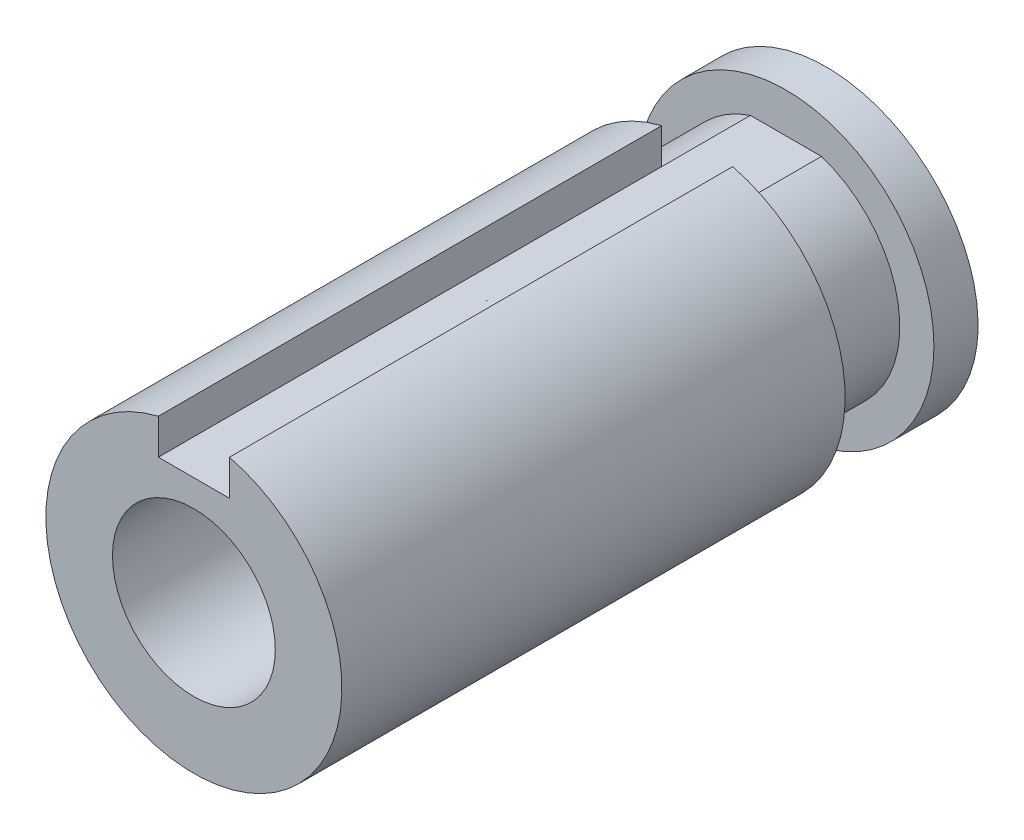
ISO-10303-21;
HEADER;
FILE_DESCRIPTION(('STEP AP214'),'2;1');
FILE_NAME('part.step','',(''),(''),'','','');
FILE_SCHEMA(('AUTOMOTIVE_DESIGN { 1 0 10303 214 1 1 1 1 }'));
ENDSEC;
DATA;
#1=APPLICATION_CONTEXT('core data for automotive mechanical design processes');
#2=APPLICATION_PROTOCOL_DEFINITION('international standard','automotive_design',2000,#1);
#3=PRODUCT_CONTEXT('',#1,'mechanical');
#4=PRODUCT('Part','Part','',(#3));
#5=PRODUCT_RELATED_PRODUCT_CATEGORY('part','',(#4));
#6=PRODUCT_DEFINITION_FORMATION('','',#4);
#7=PRODUCT_DEFINITION_CONTEXT('part definition',#1,'design');
#8=PRODUCT_DEFINITION('design','',#6,#7);
#9=PRODUCT_DEFINITION_SHAPE('','',#8);
#10=(LENGTH_UNIT() NAMED_UNIT(*) SI_UNIT(.MILLI.,.METRE.));
#11=(NAMED_UNIT(*) PLANE_ANGLE_UNIT() SI_UNIT($,.RADIAN.));
#12=(NAMED_UNIT(*) SI_UNIT($,.STERADIAN.) SOLID_ANGLE_UNIT());
#13=UNCERTAINTY_MEASURE_WITH_UNIT(LENGTH_MEASURE(1.E-05),#10,'distance_accuracy_value','');
#14=(GEOMETRIC_REPRESENTATION_CONTEXT(3) GLOBAL_UNCERTAINTY_ASSIGNED_CONTEXT((#13)) GLOBAL_UNIT_ASSIGNED_CONTEXT((#10,
#11,#12)) REPRESENTATION_CONTEXT('',''));
#15=CARTESIAN_POINT('',(0.,0.,0.));
#16=DIRECTION('',(0.,0.,1.));
#17=DIRECTION('',(1.,0.,0.));
#18=AXIS2_PLACEMENT_3D('',#15,#16,#17);
#19=CARTESIAN_POINT('',(83.1214475862055,218.92718515,-261.407467535877));
#20=DIRECTION('',(0.,0.,1.));
#21=DIRECTION('',(1.,0.,0.));
#22=AXIS2_PLACEMENT_3D('',#19,#20,#21);
#23=CYLINDRICAL_SURFACE('',#22,5.00000000000001);
#24=CARTESIAN_POINT('',(88.1214475862055,218.92718515,-237.288175350977));
#25=CARTESIAN_POINT('',(88.1214485924202,219.067701091688,-237.284621218196));
#26=CARTESIAN_POINT('',(88.115521738708,219.208200083436,-237.281051005901));
#27=CARTESIAN_POINT('',(88.0918558108255,219.488245602048,-237.273902145595));
#28=CARTESIAN_POINT('',(88.0741136279349,219.627791868476,-237.270323495611));
#29=CARTESIAN_POINT('',(88.0269176375375,219.905016035283,-237.263182237976));
#30=CARTESIAN_POINT('',(87.9974533922825,220.042692157123,-237.259619647493));
#31=CARTESIAN_POINT('',(87.9270102767965,220.31512206006,-237.25253941476));
#32=CARTESIAN_POINT('',(87.8860271994302,220.449874753998,-237.249021789425));
#33=CARTESIAN_POINT('',(87.7928814643226,220.715333718544,-237.242063138336));
#34=CARTESIAN_POINT('',(87.7407282276771,220.846043293518,-237.238622050712));
#35=CARTESIAN_POINT('',(87.6255708060574,221.102652590237,-237.231839501263));
#36=CARTESIAN_POINT('',(87.562562627488,221.228550520848,-237.228498076638));
#37=CARTESIAN_POINT('',(87.4261984645568,221.474513347863,-237.221945332768));
#38=CARTESIAN_POINT('',(87.3528488986916,221.594581800719,-237.2187339344));
#39=CARTESIAN_POINT('',(87.1962642211332,221.82815840552,-237.212464440085));
#40=CARTESIAN_POINT('',(87.1130254716788,221.941664120377,-237.209406401144));
#41=CARTESIAN_POINT('',(86.9373087905502,222.161217591279,-237.203471774107));
#42=CARTESIAN_POINT('',(86.8448343736536,222.267268158515,-237.200595117658));
#43=CARTESIAN_POINT('',(86.6512408375296,222.471241835581,-237.195045565511));
#44=CARTESIAN_POINT('',(86.550118538427,222.569161929478,-237.192372745453));
#45=CARTESIAN_POINT('',(86.3400123141715,222.756102414356,-237.187256106263));
#46=CARTESIAN_POINT('',(86.2310310019245,222.845125739995,-237.184812211634));
#47=CARTESIAN_POINT('',(86.0059099481396,223.01370676668,-237.180173060523));
#48=CARTESIAN_POINT('',(85.8897675791345,223.09326096165,-237.177977896152));
#49=CARTESIAN_POINT('',(85.6512724029503,223.242244969027,-237.17385827254));
#50=CARTESIAN_POINT('',(85.528924099064,223.311681985121,-237.171933620723));
#51=CARTESIAN_POINT('',(85.2787639957701,223.440028680309,-237.168369790025));
#52=CARTESIAN_POINT('',(85.1509501960451,223.498934463498,-237.166730716797));
#53=CARTESIAN_POINT('',(84.8908582295888,223.605747079808,-237.163754337277));
#54=CARTESIAN_POINT('',(84.7585817453283,223.653658006092,-237.162416918689));
#55=CARTESIAN_POINT('',(84.4904136805622,223.738183723553,-237.160054818994));
#56=CARTESIAN_POINT('',(84.3545207836933,223.774794338633,-237.159030253504));
#57=CARTESIAN_POINT('',(84.0802196057793,223.836410210759,-237.157304621625));
#58=CARTESIAN_POINT('',(83.9418132032142,223.861423791714,-237.156603323208));
#59=CARTESIAN_POINT('',(83.6633716469518,223.899720294919,-237.155529161324));
#60=CARTESIAN_POINT('',(83.5233359108877,223.912998883586,-237.155156419189));
#61=CARTESIAN_POINT('',(83.1023820963958,223.935017920567,-237.15453844291));
#62=CARTESIAN_POINT('',(82.8203182786401,223.926008550709,-237.154791580387));
#63=CARTESIAN_POINT('',(82.2619152948117,223.860776592211,-237.156621629888));
#64=CARTESIAN_POINT('',(81.9855750786857,223.804562743755,-237.158198296852));
#65=CARTESIAN_POINT('',(81.4462152888462,223.646561683337,-237.162616276939));
#66=CARTESIAN_POINT('',(81.1831957307537,223.544774417933,-237.165457591545));
#67=CARTESIAN_POINT('',(80.6779692482799,223.298502407121,-237.172302113826));
#68=CARTESIAN_POINT('',(80.4357641110686,223.154014000023,-237.176305421142));
#69=CARTESIAN_POINT('',(79.979045711973,222.826451374517,-237.185330597933));
#70=CARTESIAN_POINT('',(79.7645324806932,222.643377113465,-237.190352468533));
#71=CARTESIAN_POINT('',(79.369219054698,222.243779032614,-237.201240893863));
#72=CARTESIAN_POINT('',(79.1884292727101,222.027244919087,-237.207107708498));
#73=CARTESIAN_POINT('',(78.8657660611365,221.5669158783,-237.219485429615));
#74=CARTESIAN_POINT('',(78.7238927154473,221.323120892274,-237.225996337485));
#75=CARTESIAN_POINT('',(78.4830375157318,220.815095529027,-237.239450920289));
#76=CARTESIAN_POINT('',(78.384071091107,220.550857840763,-237.246394749878));
#77=CARTESIAN_POINT('',(78.2319081905019,220.009522516761,-237.260494076716));
#78=CARTESIAN_POINT('',(78.1787117805419,219.732424862475,-237.267649574272));
#79=CARTESIAN_POINT('',(78.1195902340384,219.173167074139,-237.281958521603));
#80=CARTESIAN_POINT('',(78.1136759411564,218.89100579367,-237.289111970532));
#81=CARTESIAN_POINT('',(78.1493164768453,218.329691868029,-237.303210751544));
#82=CARTESIAN_POINT('',(78.1908713235764,218.050539224007,-237.310156083546));
#83=CARTESIAN_POINT('',(78.3202749082715,217.503165398879,-237.323651272245));
#84=CARTESIAN_POINT('',(78.4081240826107,217.234944320841,-237.330201125212));
#85=CARTESIAN_POINT('',(78.6276271733532,216.717054789507,-237.342739042563));
#86=CARTESIAN_POINT('',(78.7592810503664,216.467386319528,-237.348727107452));
#87=CARTESIAN_POINT('',(79.0626334099668,215.993739701738,-237.359997864054));
#88=CARTESIAN_POINT('',(79.2343245942989,215.769756882869,-237.365280684047));
#89=CARTESIAN_POINT('',(79.6128904456528,215.353795088106,-237.375024356094));
#90=CARTESIAN_POINT('',(79.8197650783341,215.161816080975,-237.37948520895));
#91=CARTESIAN_POINT('',(80.2627793653571,214.815366972634,-237.387490362659));
#92=CARTESIAN_POINT('',(80.4989110952314,214.660886748045,-237.391034910899));
#93=CARTESIAN_POINT('',(80.993728301075,214.393763666564,-237.397138746839));
#94=CARTESIAN_POINT('',(81.2524137216887,214.28112070699,-237.399698036957));
#95=CARTESIAN_POINT('',(81.7851211475231,214.100886350946,-237.40378284698));
#96=CARTESIAN_POINT('',(82.0591393435093,214.033283818144,-237.405308622425));
#97=CARTESIAN_POINT('',(82.4754821133788,213.967085821835,-237.406801396538));
#98=CARTESIAN_POINT('',(82.615225424708,213.950888231923,-237.40716632154));
#99=CARTESIAN_POINT('',(82.8955661597501,213.93031685526,-237.407629699135));
#100=CARTESIAN_POINT('',(83.0361632490912,213.925938705552,-237.407728250056));
#101=CARTESIAN_POINT('',(83.3172480359577,213.929042303364,-237.407658361124));
#102=CARTESIAN_POINT('',(83.4577357019181,213.936526708182,-237.407489861451));
#103=CARTESIAN_POINT('',(83.7375316158767,213.963297529744,-237.406886722909));
#104=CARTESIAN_POINT('',(83.8768402801116,213.982579588769,-237.406452182309));
#105=CARTESIAN_POINT('',(84.1533887369889,214.032815270103,-237.405318774578));
#106=CARTESIAN_POINT('',(84.2906277431876,214.063773218394,-237.404619809477));
#107=CARTESIAN_POINT('',(84.5619587301958,214.137125617074,-237.402961071689));
#108=CARTESIAN_POINT('',(84.6960518534054,214.1795158438,-237.402001395323));
#109=CARTESIAN_POINT('',(84.9602416790105,214.275454920117,-237.399825136629));
#110=CARTESIAN_POINT('',(85.0903368149318,214.329008081139,-237.398608455037));
#111=CARTESIAN_POINT('',(85.3455042998896,214.446859901479,-237.395924638533));
#112=CARTESIAN_POINT('',(85.4705784842305,214.511154589269,-237.394457596184));
#113=CARTESIAN_POINT('',(85.7149068314893,214.650068830723,-237.391279277298));
#114=CARTESIAN_POINT('',(85.83415906036,214.724691784275,-237.389567920331));
#115=CARTESIAN_POINT('',(86.0659089945484,214.88368585382,-237.385910449911));
#116=CARTESIAN_POINT('',(86.1784091747155,214.968053364538,-237.383964423269));
#117=CARTESIAN_POINT('',(86.3959483330626,215.145994933178,-237.379846120664));
#118=CARTESIAN_POINT('',(86.5009842636259,215.23957271484,-237.377673753171));
#119=CARTESIAN_POINT('',(86.7027612642732,215.43520411957,-237.373115586249));
#120=CARTESIAN_POINT('',(86.7995053772658,215.537254606048,-237.370729865779));
#121=CARTESIAN_POINT('',(86.9841127816744,215.749201500854,-237.365755573759));
#122=CARTESIAN_POINT('',(87.0719705439563,215.859102722278,-237.363166877673));
#123=CARTESIAN_POINT('',(87.2380824017901,216.085871207305,-237.357803271158));
#124=CARTESIAN_POINT('',(87.3163400207799,216.202735891644,-237.355028429631));
#125=CARTESIAN_POINT('',(87.4628141274401,216.442768627701,-237.349304422777));
#126=CARTESIAN_POINT('',(87.5310195593927,216.565943421848,-237.346355070439));
#127=CARTESIAN_POINT('',(87.6567793066142,216.817554713301,-237.340303385732));
#128=CARTESIAN_POINT('',(87.7143375021097,216.945989272839,-237.337201109617));
#129=CARTESIAN_POINT('',(87.8183789390649,217.207135181049,-237.330864285166));
#130=CARTESIAN_POINT('',(87.8648719840407,217.339842624767,-237.327629856914));
#131=CARTESIAN_POINT('',(87.9465077911363,217.608653898648,-237.321047666405));
#132=CARTESIAN_POINT('',(87.9816535318979,217.74475682738,-237.317699934145));
#133=CARTESIAN_POINT('',(88.0476823857142,218.053695790671,-237.310065152478));
#134=CARTESIAN_POINT('',(88.0753210201718,218.227234123461,-237.305751910132));
#135=CARTESIAN_POINT('',(88.1122029934648,218.576252162831,-237.297025918672));
#136=CARTESIAN_POINT('',(88.1214463298096,218.751731869675,-237.292613169546));
#137=CARTESIAN_POINT('',(88.1214475862055,218.92718515,-237.288175350977));
#138=B_SPLINE_CURVE_WITH_KNOTS('',3,(#24,#25,#26,#27,#28,#29,#30,#31,#32,#33,#34,#35,#36,#37,
#38,#39,#40,#41,#42,#43,#44,#45,#46,#47,#48,#49,#50,#51,#52,#53,#54,#55,#56,#57,#58,#59,#60,#61,
#62,#63,#64,#65,#66,#67,#68,#69,#70,#71,#72,#73,#74,#75,#76,#77,#78,#79,#80,#81,#82,#83,#84,#85,
#86,#87,#88,#89,#90,#91,#92,#93,#94,#95,#96,#97,#98,#99,#100,#101,#102,#103,#104,#105,#106,#107,
#108,#109,#110,#111,#112,#113,#114,#115,#116,#117,#118,#119,#120,#121,#122,#123,#124,#125,#126,
#127,#128,#129,#130,#131,#132,#133,#134,#135,#136,#137),.UNSPECIFIED.,.T.,.F.,(4,2,2,2,2,2,2,2,
2,2,2,2,2,2,2,2,2,2,2,2,2,2,2,2,2,2,2,2,2,2,2,2,2,2,2,2,2,2,2,2,2,2,2,2,2,2,2,2,2,2,2,2,2,2,2,2,
4),(0.,0.421529355097772,0.843169662240267,1.26518625649451,1.68735718873546,2.10917344745801,
2.53114522750345,2.95285624970039,3.37472288249725,3.7964295747314,4.21829200316932,
4.64001481490824,5.0618932927599,5.48346989893611,5.90520214115175,6.32677712540747,
6.74850771921238,7.169935140454,7.59151812452478,8.43377609609858,9.27587815307957,
10.1179811975612,10.9601564746884,11.8023326825641,12.6447684987582,13.4872061310702,
14.3299464546183,15.1726879937606,16.015622801361,16.8585579314403,17.7015010072559,
18.5444433250803,19.3872321059615,20.2300200642539,21.0725802451514,21.9151383581282,
22.757488069614,23.1791160151022,23.6005883020249,24.0221550150477,24.4435661071489,
24.8651334880234,25.2865453334547,25.7081202422692,26.1295396233154,26.5510980598669,
26.9725010255938,27.3940750711353,27.8154937401965,28.2371730256764,28.6586970807198,
29.0806813361352,29.5025115013893,29.9239665300141,30.3453108375201,30.8716475449651,
31.3979843236756),.UNSPECIFIED.);
#139=CARTESIAN_POINT('',(88.1214475862055,218.92718515,-237.288175350977));
#140=VERTEX_POINT('',#139);
#141=EDGE_CURVE('E166',#140,#140,#138,.T.);
#142=ORIENTED_EDGE('',*,*,#141,.T.);
#143=EDGE_LOOP('',(#142));
#144=FACE_BOUND('',#143,.T.);
#145=CARTESIAN_POINT('',(83.1214475862055,218.92718515,-235.8));
#146=DIRECTION('',(0.,0.,1.));
#147=DIRECTION('',(1.,0.,0.));
#148=AXIS2_PLACEMENT_3D('',#145,#146,#147);
#149=CIRCLE('',#148,5.00000000000001);
#150=CARTESIAN_POINT('',(88.1214475862056,218.92718515,-235.8));
#151=VERTEX_POINT('',#150);
#152=EDGE_CURVE('E233',#151,#151,#149,.T.);
#153=ORIENTED_EDGE('',*,*,#152,.F.);
#154=EDGE_LOOP('',(#153));
#155=FACE_BOUND('',#154,.T.);
#156=ADVANCED_FACE('F74',(#144,#155),#23,.T.);
#157=CARTESIAN_POINT('',(-358.930710146062,809.537071956127,-119.281569297286));
#158=CARTESIAN_POINT('',(-358.930710146062,519.076843178948,-231.274473432346));
#159=CARTESIAN_POINT('',(-358.930710146062,209.59718515,-237.5));
#160=B_SPLINE_CURVE_WITH_KNOTS('',2,(#157,#158,#159),.UNSPECIFIED.,.F.,.F.,(3,3),(0.,1.),.UNSPECIFIED.);
#161=DIRECTION('',(1.,0.,0.));
#162=VECTOR('',#161,1.);
#163=SURFACE_OF_LINEAR_EXTRUSION('',#160,#162);
#164=ORIENTED_EDGE('',*,*,#141,.F.);
#165=EDGE_LOOP('',(#164));
#166=FACE_BOUND('',#165,.T.);
#167=ADVANCED_FACE('F183',(#166),#163,.F.);
#168=CARTESIAN_POINT('',(83.1214475862055,218.92718515,-232.8));
#169=DIRECTION('',(0.,0.,1.));
#170=DIRECTION('',(1.,0.,0.));
#171=AXIS2_PLACEMENT_3D('',#168,#169,#170);
#172=CIRCLE('',#171,5.00000000000001);
#173=CARTESIAN_POINT('',(84.3214475862056,223.781049589805,-232.8));
#174=VERTEX_POINT('',#173);
#175=CARTESIAN_POINT('',(81.9214475862055,223.781049589805,-232.8));
#176=VERTEX_POINT('',#175);
#177=EDGE_CURVE('E138',#174,#176,#172,.F.);
#178=ORIENTED_EDGE('',*,*,#177,.F.);
#179=DIRECTION('',(0.,0.,1.));
#180=VECTOR('',#179,1.);
#181=CARTESIAN_POINT('',(84.3214475862056,223.781049589805,-235.8));
#182=LINE('',#181,#180);
#183=CARTESIAN_POINT('',(84.3214475862056,223.781049589805,-215.8));
#184=VERTEX_POINT('',#183);
#185=EDGE_CURVE('E129',#174,#184,#182,.T.);
#186=ORIENTED_EDGE('',*,*,#185,.T.);
#187=CARTESIAN_POINT('',(83.1214475862055,218.92718515,-215.8));
#188=DIRECTION('',(0.,0.,-1.));
#189=DIRECTION('',(-1.,0.,0.));
#190=AXIS2_PLACEMENT_3D('',#187,#188,#189);
#191=CIRCLE('',#190,5.00000000000001);
#192=CARTESIAN_POINT('',(81.9214475862055,223.781049589805,-215.8));
#193=VERTEX_POINT('',#192);
#194=EDGE_CURVE('E160',#193,#184,#191,.F.);
#195=ORIENTED_EDGE('',*,*,#194,.F.);
#196=DIRECTION('',(0.,0.,1.));
#197=VECTOR('',#196,1.);
#198=CARTESIAN_POINT('',(81.9214475862055,223.781049589805,-235.8));
#199=LINE('',#198,#197);
#200=EDGE_CURVE('E97',#176,#193,#199,.T.);
#201=ORIENTED_EDGE('',*,*,#200,.F.);
#202=EDGE_LOOP('',(#178,#186,#195,#201));
#203=FACE_BOUND('',#202,.T.);
#204=ADVANCED_FACE('F186',(#203),#23,.T.);
#205=CARTESIAN_POINT('',(83.1214475862055,218.92718515,-215.8));
#206=DIRECTION('',(0.,0.,-1.));
#207=DIRECTION('',(-1.,0.,0.));
#208=AXIS2_PLACEMENT_3D('',#205,#206,#207);
#209=PLANE('',#208);
#210=ORIENTED_EDGE('',*,*,#194,.T.);
#211=DIRECTION('',(0.,1.,0.));
#212=VECTOR('',#211,1.);
#213=CARTESIAN_POINT('',(84.3214475862056,223.781049589805,-215.8));
#214=LINE('',#213,#212);
#215=CARTESIAN_POINT('',(84.3214475862056,222.581049589805,-215.8));
#216=VERTEX_POINT('',#215);
#217=EDGE_CURVE('E235',#216,#184,#214,.T.);
#218=ORIENTED_EDGE('',*,*,#217,.F.);
#219=DIRECTION('',(1.,0.,0.));
#220=VECTOR('',#219,1.);
#221=CARTESIAN_POINT('',(81.9214475862055,222.581049589805,-215.8));
#222=LINE('',#221,#220);
#223=CARTESIAN_POINT('',(81.9214475862055,222.581049589805,-215.8));
#224=VERTEX_POINT('',#223);
#225=EDGE_CURVE('E149',#224,#216,#222,.T.);
#226=ORIENTED_EDGE('',*,*,#225,.F.);
#227=DIRECTION('',(0.,-1.,0.));
#228=VECTOR('',#227,1.);
#229=CARTESIAN_POINT('',(81.9214475862055,223.781049589805,-215.8));
#230=LINE('',#229,#228);
#231=EDGE_CURVE('E145',#193,#224,#230,.T.);
#232=ORIENTED_EDGE('',*,*,#231,.F.);
#233=EDGE_LOOP('',(#210,#218,#226,#232));
#234=FACE_BOUND('',#233,.T.);
#235=CARTESIAN_POINT('',(83.1214475862055,218.92718515,-215.800000000002));
#236=DIRECTION('',(0.,0.,-1.));
#237=DIRECTION('',(-1.,0.,0.));
#238=AXIS2_PLACEMENT_3D('',#235,#236,#237);
#239=CIRCLE('',#238,2.75000000000001);
#240=CARTESIAN_POINT('',(80.3714475862055,218.92718515,-215.800000000002));
#241=VERTEX_POINT('',#240);
#242=EDGE_CURVE('E163',#241,#241,#239,.F.);
#243=ORIENTED_EDGE('',*,*,#242,.F.);
#244=EDGE_LOOP('',(#243));
#245=FACE_BOUND('',#244,.T.);
#246=ADVANCED_FACE('F208',(#234,#245),#209,.F.);
#247=CARTESIAN_POINT('',(-358.930710146062,809.537071956127,-119.281569297286));
#248=CARTESIAN_POINT('',(-358.930710146062,519.076843178948,-231.274473432346));
#249=CARTESIAN_POINT('',(-358.930710146062,209.59718515,-237.5));
#250=B_SPLINE_CURVE_WITH_KNOTS('',2,(#247,#248,#249),.UNSPECIFIED.,.F.,.F.,(3,3),(0.,1.),.UNSPECIFIED.);
#251=DIRECTION('',(1.,0.,0.));
#252=VECTOR('',#251,1.);
#253=SURFACE_OF_LINEAR_EXTRUSION('',#250,#252);
#254=OFFSET_SURFACE('',#253,3.,.F.);
#255=CARTESIAN_POINT('',(85.8714475862056,218.92718515,-234.28721426092));
#256=CARTESIAN_POINT('',(85.8714407415553,218.77268345455,-234.291128645349));
#257=CARTESIAN_POINT('',(85.8583835487151,218.618069264448,-234.29502579208));
#258=CARTESIAN_POINT('',(85.8064757572907,218.313097357852,-234.302674167416));
#259=CARTESIAN_POINT('',(85.7675941284164,218.162744989198,-234.306425214722));
#260=CARTESIAN_POINT('',(85.6651414990324,217.870758465934,-234.313674950248));
#261=CARTESIAN_POINT('',(85.60158209601,217.729120252215,-234.317173756096));
#262=CARTESIAN_POINT('',(85.4515916362064,217.458562931411,-234.323827774494));
#263=CARTESIAN_POINT('',(85.3651662796142,217.329640665384,-234.326983072399));
#264=CARTESIAN_POINT('',(85.1718928634572,217.088138912217,-234.332870782936));
#265=CARTESIAN_POINT('',(85.0650458531143,216.975558585986,-234.335603217281));
#266=CARTESIAN_POINT('',(84.8339531016052,216.76993046323,-234.340577895034));
#267=CARTESIAN_POINT('',(84.7097067018626,216.676883406384,-234.342820119881));
#268=CARTESIAN_POINT('',(84.447386389188,216.51299865874,-234.34675959165));
#269=CARTESIAN_POINT('',(84.3093167332249,216.442154158098,-234.348457005679));
#270=CARTESIAN_POINT('',(84.0232381042765,216.324650664771,-234.351267738008));
#271=CARTESIAN_POINT('',(83.8752291662045,216.277991587135,-234.352381058359));
#272=CARTESIAN_POINT('',(83.5735126584132,216.210194421135,-234.353997541703));
#273=CARTESIAN_POINT('',(83.4198065085158,216.189050017664,-234.354500855677));
#274=CARTESIAN_POINT('',(83.1110254359659,216.172862506869,-234.354886245096));
#275=CARTESIAN_POINT('',(82.9559505169958,216.177819329344,-234.354768322212));
#276=CARTESIAN_POINT('',(82.6488530191886,216.213690999533,-234.353914000534));
#277=CARTESIAN_POINT('',(82.496830082374,216.244602784468,-234.353177674714));
#278=CARTESIAN_POINT('',(82.2001325055331,216.331501470308,-234.351103630371));
#279=CARTESIAN_POINT('',(82.0554578732406,216.387488397602,-234.349765911215));
#280=CARTESIAN_POINT('',(81.7775548850347,216.5229495859,-234.34652021288));
#281=CARTESIAN_POINT('',(81.6443271420051,216.602425103509,-234.344612203191));
#282=CARTESIAN_POINT('',(81.3931057343242,216.782603917465,-234.340271273724));
#283=CARTESIAN_POINT('',(81.2751120773318,216.883307224485,-234.337838353682));
#284=CARTESIAN_POINT('',(81.0576813590576,217.103104387139,-234.332506163898));
#285=CARTESIAN_POINT('',(80.9582481562429,217.22220205733,-234.329606797422));
#286=CARTESIAN_POINT('',(80.7807869341061,217.475390714682,-234.32341445744));
#287=CARTESIAN_POINT('',(80.702758950023,217.609481726525,-234.320121483286));
#288=CARTESIAN_POINT('',(80.5702994132073,217.888891525079,-234.313225602937));
#289=CARTESIAN_POINT('',(80.5158746327416,218.034213520127,-234.309622608145));
#290=CARTESIAN_POINT('',(80.4321955314622,218.331926914408,-234.302203112713));
#291=CARTESIAN_POINT('',(80.4029412485972,218.484318324297,-234.298386611751));
#292=CARTESIAN_POINT('',(80.3704270728418,218.791885885374,-234.290643652991));
#293=CARTESIAN_POINT('',(80.3671737715847,218.947062732718,-234.286717167564));
#294=CARTESIAN_POINT('',(80.3867705650839,219.255759461813,-234.278866175287));
#295=CARTESIAN_POINT('',(80.4096206847707,219.409279341981,-234.27494166844));
#296=CARTESIAN_POINT('',(80.4807804304193,219.710321121932,-234.267208547527));
#297=CARTESIAN_POINT('',(80.5290927704326,219.857842380508,-234.263399945862));
#298=CARTESIAN_POINT('',(80.6498091268713,220.142680782097,-234.256013205755));
#299=CARTESIAN_POINT('',(80.7222131346166,220.279997928787,-234.252435067231));
#300=CARTESIAN_POINT('',(80.8890511780499,220.540513901775,-234.24561960941));
#301=CARTESIAN_POINT('',(80.9834829258023,220.663714192355,-234.242382254768));
#302=CARTESIAN_POINT('',(81.191702222575,220.892511745075,-234.236349726581));
#303=CARTESIAN_POINT('',(81.3054897527966,220.998109024311,-234.233554552605));
#304=CARTESIAN_POINT('',(81.5491565348759,221.188670478081,-234.228496704667));
#305=CARTESIAN_POINT('',(81.6790312154313,221.273640493811,-234.226233879961));
#306=CARTESIAN_POINT('',(81.9512111677617,221.42056920466,-234.222313362637));
#307=CARTESIAN_POINT('',(82.0935164024607,221.482527968413,-234.220655668215));
#308=CARTESIAN_POINT('',(82.3864661522097,221.58165414248,-234.218000457601));
#309=CARTESIAN_POINT('',(82.5371078240445,221.61882994949,-234.217002717812));
#310=CARTESIAN_POINT('',(82.8424972588295,221.667366030823,-234.215699621095));
#311=CARTESIAN_POINT('',(82.9972450228486,221.678726298423,-234.215394264348));
#312=CARTESIAN_POINT('',(83.3064156492822,221.675308314539,-234.215486094927));
#313=CARTESIAN_POINT('',(83.4608385782249,221.660536072997,-234.21588312072));
#314=CARTESIAN_POINT('',(83.7650118353814,221.605284956134,-234.217366189184));
#315=CARTESIAN_POINT('',(83.9147621558156,221.564806038017,-234.218452233002));
#316=CARTESIAN_POINT('',(84.2053424114959,221.459292000241,-234.221277371651));
#317=CARTESIAN_POINT('',(84.3461721887533,221.39425644581,-234.223016478045));
#318=CARTESIAN_POINT('',(84.6149082640428,221.241480686128,-234.2270905247));
#319=CARTESIAN_POINT('',(84.7428150565814,221.15374135011,-234.229425442151));
#320=CARTESIAN_POINT('',(84.9820999246201,220.95803873189,-234.234615658673));
#321=CARTESIAN_POINT('',(85.0934759818272,220.850072983811,-234.237471021191));
#322=CARTESIAN_POINT('',(85.2965507615522,220.616955580218,-234.243611656857));
#323=CARTESIAN_POINT('',(85.3882445531412,220.491799630951,-234.246897037406));
#324=CARTESIAN_POINT('',(85.5493853847532,220.227787155677,-234.253796565095));
#325=CARTESIAN_POINT('',(85.6188142209269,220.088919539695,-234.257410978168));
#326=CARTESIAN_POINT('',(85.7332924196857,219.801613393612,-234.264852880517));
#327=CARTESIAN_POINT('',(85.778370946005,219.65318655199,-234.268680108819));
#328=CARTESIAN_POINT('',(85.8308652822894,219.4077104959,-234.274978031608));
#329=CARTESIAN_POINT('',(85.8460646539822,219.312254956965,-234.277419531394));
#330=CARTESIAN_POINT('',(85.8663579459579,219.120275977727,-234.282314352428));
#331=CARTESIAN_POINT('',(85.8714518642816,219.023752537217,-234.284767673679));
#332=CARTESIAN_POINT('',(85.8714475862056,218.92718515,-234.28721426092));
#333=B_SPLINE_CURVE_WITH_KNOTS('',3,(#255,#256,#257,#258,#259,#260,#261,#262,#263,#264,#265,
#266,#267,#268,#269,#270,#271,#272,#273,#274,#275,#276,#277,#278,#279,#280,#281,#282,#283,#284,
#285,#286,#287,#288,#289,#290,#291,#292,#293,#294,#295,#296,#297,#298,#299,#300,#301,#302,#303,
#304,#305,#306,#307,#308,#309,#310,#311,#312,#313,#314,#315,#316,#317,#318,#319,#320,#321,#322,
#323,#324,#325,#326,#327,#328,#329,#330,#331,#332),.UNSPECIFIED.,.T.,.F.,(4,2,2,2,2,2,2,2,2,2,2,
2,2,2,2,2,2,2,2,2,2,2,2,2,2,2,2,2,2,2,2,2,2,2,2,2,2,2,4),(0.,0.463301310286571,
0.927160326683258,1.39080161273899,1.85432742769384,2.31782943405776,2.78134898897247,
3.24472623631077,3.70810185604833,4.17136276268446,4.63462242336142,5.0978274254434,
5.56103291502184,6.02426318989167,6.48749369764907,6.95082039776768,7.41414786064587,
7.87760817433032,8.34106918675671,8.80464768967968,9.26822663535017,9.73185500450218,
10.1954832066099,10.6590632748892,11.1226428929345,11.5860910817427,12.049537888297,
12.5128275948915,12.9761174221115,13.4393007160053,13.9024847810149,14.3656770470261,
14.8288515819622,15.2920826209982,15.7554295765822,16.2191544049186,16.6823226036656,
16.9718973440854,17.26147214065),.UNSPECIFIED.);
#334=CARTESIAN_POINT('',(85.8714475862056,218.92718515,-234.28721426092));
#335=VERTEX_POINT('',#334);
#336=EDGE_CURVE('E83',#335,#335,#333,.T.);
#337=ORIENTED_EDGE('',*,*,#336,.F.);
#338=EDGE_LOOP('',(#337));
#339=FACE_BOUND('',#338,.T.);
#340=ADVANCED_FACE('F188',(#339),#254,.T.);
#341=CARTESIAN_POINT('',(83.1214475862055,218.92718515,-500000.));
#342=DIRECTION('',(0.,0.,1.));
#343=DIRECTION('',(1.,0.,0.));
#344=AXIS2_PLACEMENT_3D('',#341,#342,#343);
#345=CYLINDRICAL_SURFACE('',#344,2.75000000000001);
#346=ORIENTED_EDGE('',*,*,#242,.T.);
#347=EDGE_LOOP('',(#346));
#348=FACE_BOUND('',#347,.T.);
#349=ORIENTED_EDGE('',*,*,#336,.T.);
#350=EDGE_LOOP('',(#349));
#351=FACE_BOUND('',#350,.T.);
#352=ADVANCED_FACE('F211',(#348,#351),#345,.F.);
#353=CARTESIAN_POINT('',(84.3214475862056,223.781049589805,-235.8));
#354=DIRECTION('',(1.,0.,0.));
#355=DIRECTION('',(0.,0.,-1.));
#356=AXIS2_PLACEMENT_3D('',#353,#354,#355);
#357=PLANE('',#356);
#358=ORIENTED_EDGE('',*,*,#185,.F.);
#359=DIRECTION('',(0.,-1.,0.));
#360=VECTOR('',#359,1.);
#361=CARTESIAN_POINT('',(84.3214475862056,223.781049589805,-232.8));
#362=LINE('',#361,#360);
#363=CARTESIAN_POINT('',(84.3214475862055,222.581049589805,-232.8));
#364=VERTEX_POINT('',#363);
#365=EDGE_CURVE('E135',#174,#364,#362,.T.);
#366=ORIENTED_EDGE('',*,*,#365,.T.);
#367=DIRECTION('',(0.,0.,1.));
#368=VECTOR('',#367,1.);
#369=CARTESIAN_POINT('',(84.3214475862056,222.581049589805,-235.8));
#370=LINE('',#369,#368);
#371=EDGE_CURVE('E130',#364,#216,#370,.T.);
#372=ORIENTED_EDGE('',*,*,#371,.T.);
#373=ORIENTED_EDGE('',*,*,#217,.T.);
#374=EDGE_LOOP('',(#358,#366,#372,#373));
#375=FACE_BOUND('',#374,.T.);
#376=ADVANCED_FACE('F142',(#375),#357,.F.);
#377=CARTESIAN_POINT('',(81.9214475862055,222.581049589805,-235.8));
#378=DIRECTION('',(0.,-1.,0.));
#379=DIRECTION('',(0.,0.,-1.));
#380=AXIS2_PLACEMENT_3D('',#377,#378,#379);
#381=PLANE('',#380);
#382=ORIENTED_EDGE('',*,*,#225,.T.);
#383=ORIENTED_EDGE('',*,*,#371,.F.);
#384=CARTESIAN_POINT('',(84.3214475862056,222.581049589805,-235.8));
#385=VERTEX_POINT('',#384);
#386=EDGE_CURVE('E121',#385,#364,#370,.T.);
#387=ORIENTED_EDGE('',*,*,#386,.F.);
#388=DIRECTION('',(1.,0.,0.));
#389=VECTOR('',#388,1.);
#390=CARTESIAN_POINT('',(81.9214475862055,222.581049589805,-235.8));
#391=LINE('',#390,#389);
#392=CARTESIAN_POINT('',(81.9214475862056,222.581049589805,-235.8));
#393=VERTEX_POINT('',#392);
#394=EDGE_CURVE('E159',#393,#385,#391,.T.);
#395=ORIENTED_EDGE('',*,*,#394,.F.);
#396=DIRECTION('',(0.,0.,1.));
#397=VECTOR('',#396,1.);
#398=CARTESIAN_POINT('',(81.9214475862055,222.581049589805,-235.8));
#399=LINE('',#398,#397);
#400=CARTESIAN_POINT('',(81.9214475862055,222.581049589805,-232.8));
#401=VERTEX_POINT('',#400);
#402=EDGE_CURVE('E151',#393,#401,#399,.T.);
#403=ORIENTED_EDGE('',*,*,#402,.T.);
#404=EDGE_CURVE('E153',#401,#224,#399,.T.);
#405=ORIENTED_EDGE('',*,*,#404,.T.);
#406=EDGE_LOOP('',(#382,#383,#387,#395,#403,#405));
#407=FACE_BOUND('',#406,.T.);
#408=ADVANCED_FACE('F147',(#407),#381,.F.);
#409=CARTESIAN_POINT('',(81.9214475862055,223.781049589805,-235.8));
#410=DIRECTION('',(-1.,0.,0.));
#411=DIRECTION('',(0.,0.,1.));
#412=AXIS2_PLACEMENT_3D('',#409,#410,#411);
#413=PLANE('',#412);
#414=ORIENTED_EDGE('',*,*,#404,.F.);
#415=DIRECTION('',(0.,1.,0.));
#416=VECTOR('',#415,1.);
#417=CARTESIAN_POINT('',(81.9214475862055,223.781049589805,-232.8));
#418=LINE('',#417,#416);
#419=EDGE_CURVE('E14',#401,#176,#418,.T.);
#420=ORIENTED_EDGE('',*,*,#419,.T.);
#421=ORIENTED_EDGE('',*,*,#200,.T.);
#422=ORIENTED_EDGE('',*,*,#231,.T.);
#423=EDGE_LOOP('',(#414,#420,#421,#422));
#424=FACE_BOUND('',#423,.T.);
#425=ADVANCED_FACE('F241',(#424),#413,.F.);
#426=CARTESIAN_POINT('',(83.1214475862055,218.92718515,-235.8));
#427=DIRECTION('',(0.,0.,1.));
#428=DIRECTION('',(1.,0.,0.));
#429=AXIS2_PLACEMENT_3D('',#426,#427,#428);
#430=PLANE('',#429);
#431=ORIENTED_EDGE('',*,*,#152,.T.);
#432=EDGE_LOOP('',(#431));
#433=FACE_BOUND('',#432,.T.);
#434=ORIENTED_EDGE('',*,*,#394,.T.);
#435=CARTESIAN_POINT('',(83.1214475862055,218.92718515,-235.8));
#436=DIRECTION('',(0.,0.,1.));
#437=DIRECTION('',(1.,0.,0.));
#438=AXIS2_PLACEMENT_3D('',#435,#436,#437);
#439=CIRCLE('',#438,3.84587120747287);
#440=EDGE_CURVE('E124',#393,#385,#439,.T.);
#441=ORIENTED_EDGE('',*,*,#440,.F.);
#442=EDGE_LOOP('',(#434,#441));
#443=FACE_BOUND('',#442,.T.);
#444=ADVANCED_FACE('F267',(#433,#443),#430,.T.);
#445=CARTESIAN_POINT('',(83.1214475862055,218.92718515,-232.8));
#446=DIRECTION('',(0.,0.,1.));
#447=DIRECTION('',(1.,0.,0.));
#448=AXIS2_PLACEMENT_3D('',#445,#446,#447);
#449=PLANE('',#448);
#450=ORIENTED_EDGE('',*,*,#177,.T.);
#451=ORIENTED_EDGE('',*,*,#419,.F.);
#452=CARTESIAN_POINT('',(83.1214475862055,218.92718515,-232.8));
#453=DIRECTION('',(0.,0.,1.));
#454=DIRECTION('',(1.,0.,0.));
#455=AXIS2_PLACEMENT_3D('',#452,#453,#454);
#456=CIRCLE('',#455,3.84587120747287);
#457=EDGE_CURVE('E90',#401,#364,#456,.T.);
#458=ORIENTED_EDGE('',*,*,#457,.T.);
#459=ORIENTED_EDGE('',*,*,#365,.F.);
#460=EDGE_LOOP('',(#450,#451,#458,#459));
#461=FACE_BOUND('',#460,.T.);
#462=ADVANCED_FACE('F134',(#461),#449,.F.);
#463=CARTESIAN_POINT('',(83.1214475862055,218.92718515,-232.8));
#464=DIRECTION('',(0.,0.,-1.));
#465=DIRECTION('',(-1.,0.,0.));
#466=AXIS2_PLACEMENT_3D('',#463,#464,#465);
#467=CYLINDRICAL_SURFACE('',#466,3.84587120747287);
#468=ORIENTED_EDGE('',*,*,#457,.F.);
#469=ORIENTED_EDGE('',*,*,#402,.F.);
#470=ORIENTED_EDGE('',*,*,#440,.T.);
#471=ORIENTED_EDGE('',*,*,#386,.T.);
#472=EDGE_LOOP('',(#468,#469,#470,#471));
#473=FACE_BOUND('',#472,.T.);
#474=ADVANCED_FACE('F122',(#473),#467,.T.);
#475=CLOSED_SHELL('',(#156,#167,#204,#246,#340,#352,#376,#408,#425,#444,#462,#474));
#476=MANIFOLD_SOLID_BREP('B2',#475);
#477=ADVANCED_BREP_SHAPE_REPRESENTATION('',(#18,#476),#14);
#478=SHAPE_DEFINITION_REPRESENTATION(#9,#477);
ENDSEC;
END-ISO-10303-21;
